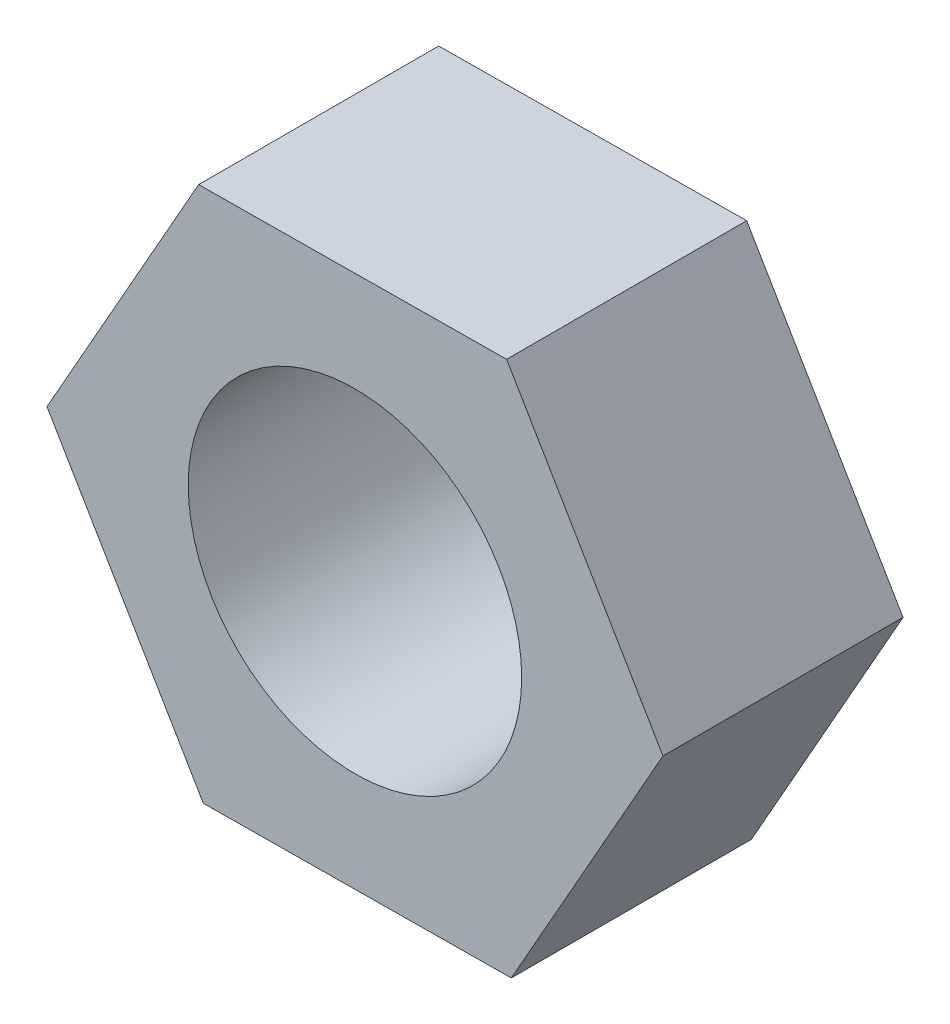
ISO-10303-21;
HEADER;
FILE_DESCRIPTION(('STEP AP214'),'2;1');
FILE_NAME('part.step','',(''),(''),'','','');
FILE_SCHEMA(('AUTOMOTIVE_DESIGN { 1 0 10303 214 1 1 1 1 }'));
ENDSEC;
DATA;
#1=APPLICATION_CONTEXT('core data for automotive mechanical design processes');
#2=APPLICATION_PROTOCOL_DEFINITION('international standard','automotive_design',2000,#1);
#3=PRODUCT_CONTEXT('',#1,'mechanical');
#4=PRODUCT('Part','Part','',(#3));
#5=PRODUCT_RELATED_PRODUCT_CATEGORY('part','',(#4));
#6=PRODUCT_DEFINITION_FORMATION('','',#4);
#7=PRODUCT_DEFINITION_CONTEXT('part definition',#1,'design');
#8=PRODUCT_DEFINITION('design','',#6,#7);
#9=PRODUCT_DEFINITION_SHAPE('','',#8);
#10=(LENGTH_UNIT() NAMED_UNIT(*) SI_UNIT(.MILLI.,.METRE.));
#11=(NAMED_UNIT(*) PLANE_ANGLE_UNIT() SI_UNIT($,.RADIAN.));
#12=(NAMED_UNIT(*) SI_UNIT($,.STERADIAN.) SOLID_ANGLE_UNIT());
#13=UNCERTAINTY_MEASURE_WITH_UNIT(LENGTH_MEASURE(1.E-05),#10,'distance_accuracy_value','');
#14=(GEOMETRIC_REPRESENTATION_CONTEXT(3) GLOBAL_UNCERTAINTY_ASSIGNED_CONTEXT((#13)) GLOBAL_UNIT_ASSIGNED_CONTEXT((#10,
#11,#12)) REPRESENTATION_CONTEXT('',''));
#15=CARTESIAN_POINT('',(0.,0.,0.));
#16=DIRECTION('',(0.,0.,1.));
#17=DIRECTION('',(1.,0.,0.));
#18=AXIS2_PLACEMENT_3D('',#15,#16,#17);
#19=CARTESIAN_POINT('',(0.,0.,3.6));
#20=DIRECTION('',(0.,0.,1.));
#21=DIRECTION('',(1.,0.,0.));
#22=AXIS2_PLACEMENT_3D('',#19,#20,#21);
#23=PLANE('',#22);
#24=DIRECTION('',(0.999961257640527,0.00880245522430764,0.));
#25=VECTOR('',#24,1.);
#26=CARTESIAN_POINT('',(-2.27410178421459,-4.02017343013524,3.6));
#27=LINE('',#26,#25);
#28=CARTESIAN_POINT('',(-2.27410178421459,-4.02017343013524,3.6));
#29=VERTEX_POINT('',#28);
#30=CARTESIAN_POINT('',(2.34452142600905,-3.97951663098897,3.6));
#31=VERTEX_POINT('',#30);
#32=EDGE_CURVE('E146',#29,#31,#27,.T.);
#33=ORIENTED_EDGE('',*,*,#32,.T.);
#34=DIRECTION('',(0.492357478980338,0.870393079529086,0.));
#35=VECTOR('',#34,1.);
#36=CARTESIAN_POINT('',(2.34452142600905,-3.97951663098897,3.6));
#37=LINE('',#36,#35);
#38=CARTESIAN_POINT('',(4.61862321022364,0.0406567991462687,3.6));
#39=VERTEX_POINT('',#38);
#40=EDGE_CURVE('E94',#31,#39,#37,.T.);
#41=ORIENTED_EDGE('',*,*,#40,.T.);
#42=DIRECTION('',(-0.507603778660189,0.861590624304779,0.));
#43=VECTOR('',#42,1.);
#44=CARTESIAN_POINT('',(4.61862321022364,0.0406567991462687,3.6));
#45=LINE('',#44,#43);
#46=CARTESIAN_POINT('',(2.27410178421459,4.02017343013524,3.6));
#47=VERTEX_POINT('',#46);
#48=EDGE_CURVE('E107',#39,#47,#45,.T.);
#49=ORIENTED_EDGE('',*,*,#48,.T.);
#50=DIRECTION('',(-0.999961257640527,-0.00880245522430746,0.));
#51=VECTOR('',#50,1.);
#52=CARTESIAN_POINT('',(2.27410178421459,4.02017343013524,3.6));
#53=LINE('',#52,#51);
#54=CARTESIAN_POINT('',(-2.34452142600905,3.97951663098897,3.6));
#55=VERTEX_POINT('',#54);
#56=EDGE_CURVE('E101',#47,#55,#53,.T.);
#57=ORIENTED_EDGE('',*,*,#56,.T.);
#58=DIRECTION('',(-0.492357478980338,-0.870393079529086,0.));
#59=VECTOR('',#58,1.);
#60=CARTESIAN_POINT('',(-2.34452142600905,3.97951663098897,3.6));
#61=LINE('',#60,#59);
#62=CARTESIAN_POINT('',(-4.61862321022364,-0.0406567991462674,3.6));
#63=VERTEX_POINT('',#62);
#64=EDGE_CURVE('E105',#55,#63,#61,.T.);
#65=ORIENTED_EDGE('',*,*,#64,.T.);
#66=DIRECTION('',(0.507603778660189,-0.861590624304779,0.));
#67=VECTOR('',#66,1.);
#68=CARTESIAN_POINT('',(-4.61862321022364,-0.0406567991462674,3.6));
#69=LINE('',#68,#67);
#70=EDGE_CURVE('E57',#63,#29,#69,.T.);
#71=ORIENTED_EDGE('',*,*,#70,.T.);
#72=EDGE_LOOP('',(#33,#41,#49,#57,#65,#71));
#73=FACE_BOUND('',#72,.T.);
#74=CARTESIAN_POINT('',(0.,0.,3.6));
#75=DIRECTION('',(0.,0.,1.));
#76=DIRECTION('',(1.,0.,0.));
#77=AXIS2_PLACEMENT_3D('',#74,#75,#76);
#78=CIRCLE('',#77,2.5);
#79=CARTESIAN_POINT('',(2.5,0.,3.6));
#80=VERTEX_POINT('',#79);
#81=EDGE_CURVE('E134',#80,#80,#78,.T.);
#82=ORIENTED_EDGE('',*,*,#81,.F.);
#83=EDGE_LOOP('',(#82));
#84=FACE_BOUND('',#83,.T.);
#85=ADVANCED_FACE('F39',(#73,#84),#23,.T.);
#86=CARTESIAN_POINT('',(0.,0.,0.));
#87=DIRECTION('',(0.,0.,1.));
#88=DIRECTION('',(1.,0.,0.));
#89=AXIS2_PLACEMENT_3D('',#86,#87,#88);
#90=PLANE('',#89);
#91=DIRECTION('',(0.999961257640527,0.00880245522430764,0.));
#92=VECTOR('',#91,1.);
#93=CARTESIAN_POINT('',(-2.27410178421459,-4.02017343013524,0.));
#94=LINE('',#93,#92);
#95=CARTESIAN_POINT('',(-2.27410178421459,-4.02017343013524,0.));
#96=VERTEX_POINT('',#95);
#97=CARTESIAN_POINT('',(2.34452142600905,-3.97951663098897,0.));
#98=VERTEX_POINT('',#97);
#99=EDGE_CURVE('E129',#96,#98,#94,.T.);
#100=ORIENTED_EDGE('',*,*,#99,.F.);
#101=DIRECTION('',(0.507603778660189,-0.861590624304779,0.));
#102=VECTOR('',#101,1.);
#103=CARTESIAN_POINT('',(-4.61862321022364,-0.0406567991462674,0.));
#104=LINE('',#103,#102);
#105=CARTESIAN_POINT('',(-4.61862321022364,-0.0406567991462674,0.));
#106=VERTEX_POINT('',#105);
#107=EDGE_CURVE('E86',#106,#96,#104,.T.);
#108=ORIENTED_EDGE('',*,*,#107,.F.);
#109=DIRECTION('',(-0.492357478980338,-0.870393079529086,0.));
#110=VECTOR('',#109,1.);
#111=CARTESIAN_POINT('',(-2.34452142600905,3.97951663098897,0.));
#112=LINE('',#111,#110);
#113=CARTESIAN_POINT('',(-2.34452142600905,3.97951663098897,0.));
#114=VERTEX_POINT('',#113);
#115=EDGE_CURVE('E80',#114,#106,#112,.T.);
#116=ORIENTED_EDGE('',*,*,#115,.F.);
#117=DIRECTION('',(-0.999961257640527,-0.00880245522430746,0.));
#118=VECTOR('',#117,1.);
#119=CARTESIAN_POINT('',(2.27410178421459,4.02017343013524,0.));
#120=LINE('',#119,#118);
#121=CARTESIAN_POINT('',(2.27410178421459,4.02017343013524,0.));
#122=VERTEX_POINT('',#121);
#123=EDGE_CURVE('E116',#122,#114,#120,.T.);
#124=ORIENTED_EDGE('',*,*,#123,.F.);
#125=DIRECTION('',(-0.507603778660189,0.861590624304779,0.));
#126=VECTOR('',#125,1.);
#127=CARTESIAN_POINT('',(4.61862321022364,0.0406567991462687,0.));
#128=LINE('',#127,#126);
#129=CARTESIAN_POINT('',(4.61862321022364,0.0406567991462687,0.));
#130=VERTEX_POINT('',#129);
#131=EDGE_CURVE('E137',#130,#122,#128,.T.);
#132=ORIENTED_EDGE('',*,*,#131,.F.);
#133=DIRECTION('',(0.492357478980338,0.870393079529086,0.));
#134=VECTOR('',#133,1.);
#135=CARTESIAN_POINT('',(2.34452142600905,-3.97951663098897,0.));
#136=LINE('',#135,#134);
#137=EDGE_CURVE('E133',#98,#130,#136,.T.);
#138=ORIENTED_EDGE('',*,*,#137,.F.);
#139=EDGE_LOOP('',(#100,#108,#116,#124,#132,#138));
#140=FACE_BOUND('',#139,.T.);
#141=CARTESIAN_POINT('',(0.,0.,0.));
#142=DIRECTION('',(0.,0.,1.));
#143=DIRECTION('',(1.,0.,0.));
#144=AXIS2_PLACEMENT_3D('',#141,#142,#143);
#145=CIRCLE('',#144,2.5);
#146=CARTESIAN_POINT('',(2.5,0.,0.));
#147=VERTEX_POINT('',#146);
#148=EDGE_CURVE('E243',#147,#147,#145,.T.);
#149=ORIENTED_EDGE('',*,*,#148,.T.);
#150=EDGE_LOOP('',(#149));
#151=FACE_BOUND('',#150,.T.);
#152=ADVANCED_FACE('F159',(#140,#151),#90,.F.);
#153=CARTESIAN_POINT('',(-2.27410178421459,-4.02017343013524,3.6));
#154=DIRECTION('',(-0.00880245522430764,0.999961257640527,0.));
#155=DIRECTION('',(-0.999961257640527,-0.00880245522430764,0.));
#156=AXIS2_PLACEMENT_3D('',#153,#154,#155);
#157=PLANE('',#156);
#158=ORIENTED_EDGE('',*,*,#99,.T.);
#159=DIRECTION('',(0.,0.,-1.));
#160=VECTOR('',#159,1.);
#161=CARTESIAN_POINT('',(2.34452142600905,-3.97951663098897,3.6));
#162=LINE('',#161,#160);
#163=EDGE_CURVE('E11',#31,#98,#162,.T.);
#164=ORIENTED_EDGE('',*,*,#163,.F.);
#165=ORIENTED_EDGE('',*,*,#32,.F.);
#166=DIRECTION('',(0.,0.,-1.));
#167=VECTOR('',#166,1.);
#168=CARTESIAN_POINT('',(-2.27410178421459,-4.02017343013524,3.6));
#169=LINE('',#168,#167);
#170=EDGE_CURVE('E125',#29,#96,#169,.T.);
#171=ORIENTED_EDGE('',*,*,#170,.T.);
#172=EDGE_LOOP('',(#158,#164,#165,#171));
#173=FACE_BOUND('',#172,.T.);
#174=ADVANCED_FACE('F41',(#173),#157,.F.);
#175=CARTESIAN_POINT('',(2.34452142600905,-3.97951663098897,3.6));
#176=DIRECTION('',(-0.870393079529086,0.492357478980338,0.));
#177=DIRECTION('',(-0.492357478980338,-0.870393079529086,0.));
#178=AXIS2_PLACEMENT_3D('',#175,#176,#177);
#179=PLANE('',#178);
#180=ORIENTED_EDGE('',*,*,#137,.T.);
#181=DIRECTION('',(0.,0.,-1.));
#182=VECTOR('',#181,1.);
#183=CARTESIAN_POINT('',(4.61862321022364,0.0406567991462687,3.6));
#184=LINE('',#183,#182);
#185=EDGE_CURVE('E49',#39,#130,#184,.T.);
#186=ORIENTED_EDGE('',*,*,#185,.F.);
#187=ORIENTED_EDGE('',*,*,#40,.F.);
#188=ORIENTED_EDGE('',*,*,#163,.T.);
#189=EDGE_LOOP('',(#180,#186,#187,#188));
#190=FACE_BOUND('',#189,.T.);
#191=ADVANCED_FACE('F184',(#190),#179,.F.);
#192=CARTESIAN_POINT('',(4.61862321022364,0.0406567991462687,3.6));
#193=DIRECTION('',(-0.861590624304779,-0.507603778660189,0.));
#194=DIRECTION('',(0.507603778660189,-0.861590624304779,0.));
#195=AXIS2_PLACEMENT_3D('',#192,#193,#194);
#196=PLANE('',#195);
#197=ORIENTED_EDGE('',*,*,#131,.T.);
#198=DIRECTION('',(0.,0.,-1.));
#199=VECTOR('',#198,1.);
#200=CARTESIAN_POINT('',(2.27410178421459,4.02017343013524,3.6));
#201=LINE('',#200,#199);
#202=EDGE_CURVE('E118',#47,#122,#201,.T.);
#203=ORIENTED_EDGE('',*,*,#202,.F.);
#204=ORIENTED_EDGE('',*,*,#48,.F.);
#205=ORIENTED_EDGE('',*,*,#185,.T.);
#206=EDGE_LOOP('',(#197,#203,#204,#205));
#207=FACE_BOUND('',#206,.T.);
#208=ADVANCED_FACE('F156',(#207),#196,.F.);
#209=CARTESIAN_POINT('',(2.27410178421459,4.02017343013524,3.6));
#210=DIRECTION('',(0.00880245522430746,-0.999961257640527,0.));
#211=DIRECTION('',(0.999961257640527,0.00880245522430746,0.));
#212=AXIS2_PLACEMENT_3D('',#209,#210,#211);
#213=PLANE('',#212);
#214=ORIENTED_EDGE('',*,*,#123,.T.);
#215=DIRECTION('',(0.,0.,-1.));
#216=VECTOR('',#215,1.);
#217=CARTESIAN_POINT('',(-2.34452142600905,3.97951663098897,3.6));
#218=LINE('',#217,#216);
#219=EDGE_CURVE('E113',#55,#114,#218,.T.);
#220=ORIENTED_EDGE('',*,*,#219,.F.);
#221=ORIENTED_EDGE('',*,*,#56,.F.);
#222=ORIENTED_EDGE('',*,*,#202,.T.);
#223=EDGE_LOOP('',(#214,#220,#221,#222));
#224=FACE_BOUND('',#223,.T.);
#225=ADVANCED_FACE('F114',(#224),#213,.F.);
#226=CARTESIAN_POINT('',(-2.34452142600905,3.97951663098897,3.6));
#227=DIRECTION('',(0.870393079529086,-0.492357478980338,0.));
#228=DIRECTION('',(0.492357478980338,0.870393079529086,0.));
#229=AXIS2_PLACEMENT_3D('',#226,#227,#228);
#230=PLANE('',#229);
#231=ORIENTED_EDGE('',*,*,#115,.T.);
#232=DIRECTION('',(0.,0.,-1.));
#233=VECTOR('',#232,1.);
#234=CARTESIAN_POINT('',(-4.61862321022364,-0.0406567991462674,3.6));
#235=LINE('',#234,#233);
#236=EDGE_CURVE('E119',#63,#106,#235,.T.);
#237=ORIENTED_EDGE('',*,*,#236,.F.);
#238=ORIENTED_EDGE('',*,*,#64,.F.);
#239=ORIENTED_EDGE('',*,*,#219,.T.);
#240=EDGE_LOOP('',(#231,#237,#238,#239));
#241=FACE_BOUND('',#240,.T.);
#242=ADVANCED_FACE('F121',(#241),#230,.F.);
#243=CARTESIAN_POINT('',(-4.61862321022364,-0.0406567991462674,3.6));
#244=DIRECTION('',(0.861590624304779,0.507603778660189,0.));
#245=DIRECTION('',(-0.507603778660189,0.861590624304779,0.));
#246=AXIS2_PLACEMENT_3D('',#243,#244,#245);
#247=PLANE('',#246);
#248=ORIENTED_EDGE('',*,*,#107,.T.);
#249=ORIENTED_EDGE('',*,*,#170,.F.);
#250=ORIENTED_EDGE('',*,*,#70,.F.);
#251=ORIENTED_EDGE('',*,*,#236,.T.);
#252=EDGE_LOOP('',(#248,#249,#250,#251));
#253=FACE_BOUND('',#252,.T.);
#254=ADVANCED_FACE('F164',(#253),#247,.F.);
#255=CARTESIAN_POINT('',(0.,0.,3.6));
#256=DIRECTION('',(0.,0.,-1.));
#257=DIRECTION('',(-1.,0.,0.));
#258=AXIS2_PLACEMENT_3D('',#255,#256,#257);
#259=CYLINDRICAL_SURFACE('',#258,2.5);
#260=ORIENTED_EDGE('',*,*,#81,.T.);
#261=EDGE_LOOP('',(#260));
#262=FACE_BOUND('',#261,.T.);
#263=ORIENTED_EDGE('',*,*,#148,.F.);
#264=EDGE_LOOP('',(#263));
#265=FACE_BOUND('',#264,.T.);
#266=ADVANCED_FACE('F166',(#262,#265),#259,.F.);
#267=CLOSED_SHELL('',(#85,#152,#174,#191,#208,#225,#242,#254,#266));
#268=MANIFOLD_SOLID_BREP('B2',#267);
#269=ADVANCED_BREP_SHAPE_REPRESENTATION('',(#18,#268),#14);
#270=SHAPE_DEFINITION_REPRESENTATION(#9,#269);
ENDSEC;
END-ISO-10303-21;
